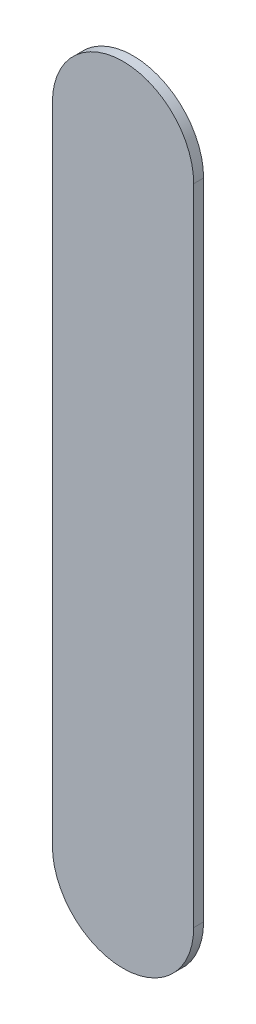
ISO-10303-21;
HEADER;
FILE_DESCRIPTION(('STEP AP214'),'2;1');
FILE_NAME('part.step','',(''),(''),'','','');
FILE_SCHEMA(('AUTOMOTIVE_DESIGN { 1 0 10303 214 1 1 1 1 }'));
ENDSEC;
DATA;
#1=APPLICATION_CONTEXT('core data for automotive mechanical design processes');
#2=APPLICATION_PROTOCOL_DEFINITION('international standard','automotive_design',2000,#1);
#3=PRODUCT_CONTEXT('',#1,'mechanical');
#4=PRODUCT('Part','Part','',(#3));
#5=PRODUCT_RELATED_PRODUCT_CATEGORY('part','',(#4));
#6=PRODUCT_DEFINITION_FORMATION('','',#4);
#7=PRODUCT_DEFINITION_CONTEXT('part definition',#1,'design');
#8=PRODUCT_DEFINITION('design','',#6,#7);
#9=PRODUCT_DEFINITION_SHAPE('','',#8);
#10=(LENGTH_UNIT() NAMED_UNIT(*) SI_UNIT(.MILLI.,.METRE.));
#11=(NAMED_UNIT(*) PLANE_ANGLE_UNIT() SI_UNIT($,.RADIAN.));
#12=(NAMED_UNIT(*) SI_UNIT($,.STERADIAN.) SOLID_ANGLE_UNIT());
#13=UNCERTAINTY_MEASURE_WITH_UNIT(LENGTH_MEASURE(1.E-05),#10,'distance_accuracy_value','');
#14=(GEOMETRIC_REPRESENTATION_CONTEXT(3) GLOBAL_UNCERTAINTY_ASSIGNED_CONTEXT((#13)) GLOBAL_UNIT_ASSIGNED_CONTEXT((#10,
#11,#12)) REPRESENTATION_CONTEXT('',''));
#15=CARTESIAN_POINT('',(0.,0.,0.));
#16=DIRECTION('',(0.,0.,1.));
#17=DIRECTION('',(1.,0.,0.));
#18=AXIS2_PLACEMENT_3D('',#15,#16,#17);
#19=CARTESIAN_POINT('',(104.515499,-61.11,1.635));
#20=DIRECTION('',(0.,0.,1.));
#21=DIRECTION('',(1.,0.,0.));
#22=AXIS2_PLACEMENT_3D('',#19,#20,#21);
#23=PLANE('',#22);
#24=DIRECTION('',(0.,1.,0.));
#25=VECTOR('',#24,1.);
#26=CARTESIAN_POINT('',(104.515499,-61.11,1.635));
#27=LINE('',#26,#25);
#28=CARTESIAN_POINT('',(104.515499,-61.11,1.635));
#29=VERTEX_POINT('',#28);
#30=CARTESIAN_POINT('',(104.515499,-58.83,1.635));
#31=VERTEX_POINT('',#30);
#32=EDGE_CURVE('E82',#29,#31,#27,.T.);
#33=ORIENTED_EDGE('',*,*,#32,.T.);
#34=CARTESIAN_POINT('',(104.265499,-58.83,1.635));
#35=DIRECTION('',(0.,0.,1.));
#36=DIRECTION('',(1.,0.,0.));
#37=AXIS2_PLACEMENT_3D('',#34,#35,#36);
#38=CIRCLE('',#37,0.25);
#39=CARTESIAN_POINT('',(104.015499,-58.83,1.635));
#40=VERTEX_POINT('',#39);
#41=EDGE_CURVE('E107',#31,#40,#38,.T.);
#42=ORIENTED_EDGE('',*,*,#41,.T.);
#43=DIRECTION('',(0.,-1.,0.));
#44=VECTOR('',#43,1.);
#45=CARTESIAN_POINT('',(104.015499,-58.83,1.635));
#46=LINE('',#45,#44);
#47=CARTESIAN_POINT('',(104.015499,-61.11,1.635));
#48=VERTEX_POINT('',#47);
#49=EDGE_CURVE('E74',#40,#48,#46,.T.);
#50=ORIENTED_EDGE('',*,*,#49,.T.);
#51=CARTESIAN_POINT('',(104.265499,-61.11,1.635));
#52=DIRECTION('',(0.,0.,1.));
#53=DIRECTION('',(-1.,0.,0.));
#54=AXIS2_PLACEMENT_3D('',#51,#52,#53);
#55=CIRCLE('',#54,0.25);
#56=EDGE_CURVE('E11',#48,#29,#55,.T.);
#57=ORIENTED_EDGE('',*,*,#56,.T.);
#58=EDGE_LOOP('',(#33,#42,#50,#57));
#59=FACE_BOUND('',#58,.T.);
#60=ADVANCED_FACE('F17',(#59),#23,.T.);
#61=CARTESIAN_POINT('',(104.515499,-61.11,1.6));
#62=DIRECTION('',(0.,0.,1.));
#63=DIRECTION('',(1.,0.,0.));
#64=AXIS2_PLACEMENT_3D('',#61,#62,#63);
#65=PLANE('',#64);
#66=CARTESIAN_POINT('',(104.265499,-61.11,1.6));
#67=DIRECTION('',(0.,0.,1.));
#68=DIRECTION('',(-1.,0.,0.));
#69=AXIS2_PLACEMENT_3D('',#66,#67,#68);
#70=CIRCLE('',#69,0.25);
#71=CARTESIAN_POINT('',(104.015499,-61.11,1.6));
#72=VERTEX_POINT('',#71);
#73=CARTESIAN_POINT('',(104.515499,-61.11,1.6));
#74=VERTEX_POINT('',#73);
#75=EDGE_CURVE('E25',#72,#74,#70,.T.);
#76=ORIENTED_EDGE('',*,*,#75,.F.);
#77=DIRECTION('',(0.,-1.,0.));
#78=VECTOR('',#77,1.);
#79=CARTESIAN_POINT('',(104.015499,-58.83,1.6));
#80=LINE('',#79,#78);
#81=CARTESIAN_POINT('',(104.015499,-58.83,1.6));
#82=VERTEX_POINT('',#81);
#83=EDGE_CURVE('E111',#82,#72,#80,.T.);
#84=ORIENTED_EDGE('',*,*,#83,.F.);
#85=CARTESIAN_POINT('',(104.265499,-58.83,1.6));
#86=DIRECTION('',(0.,0.,1.));
#87=DIRECTION('',(1.,0.,0.));
#88=AXIS2_PLACEMENT_3D('',#85,#86,#87);
#89=CIRCLE('',#88,0.25);
#90=CARTESIAN_POINT('',(104.515499,-58.83,1.6));
#91=VERTEX_POINT('',#90);
#92=EDGE_CURVE('E84',#91,#82,#89,.T.);
#93=ORIENTED_EDGE('',*,*,#92,.F.);
#94=DIRECTION('',(0.,1.,0.));
#95=VECTOR('',#94,1.);
#96=CARTESIAN_POINT('',(104.515499,-61.11,1.6));
#97=LINE('',#96,#95);
#98=EDGE_CURVE('E80',#74,#91,#97,.T.);
#99=ORIENTED_EDGE('',*,*,#98,.F.);
#100=EDGE_LOOP('',(#76,#84,#93,#99));
#101=FACE_BOUND('',#100,.T.);
#102=ADVANCED_FACE('F86',(#101),#65,.F.);
#103=CARTESIAN_POINT('',(104.265499,-61.11,1.6));
#104=DIRECTION('',(0.,0.,-1.));
#105=DIRECTION('',(-1.,0.,0.));
#106=AXIS2_PLACEMENT_3D('',#103,#104,#105);
#107=CYLINDRICAL_SURFACE('',#106,0.25);
#108=ORIENTED_EDGE('',*,*,#75,.T.);
#109=DIRECTION('',(0.,0.,1.));
#110=VECTOR('',#109,1.);
#111=CARTESIAN_POINT('',(104.515499,-61.11,1.6));
#112=LINE('',#111,#110);
#113=EDGE_CURVE('E68',#74,#29,#112,.T.);
#114=ORIENTED_EDGE('',*,*,#113,.T.);
#115=ORIENTED_EDGE('',*,*,#56,.F.);
#116=DIRECTION('',(0.,0.,1.));
#117=VECTOR('',#116,1.);
#118=CARTESIAN_POINT('',(104.015499,-61.11,1.6));
#119=LINE('',#118,#117);
#120=EDGE_CURVE('E71',#72,#48,#119,.T.);
#121=ORIENTED_EDGE('',*,*,#120,.F.);
#122=EDGE_LOOP('',(#108,#114,#115,#121));
#123=FACE_BOUND('',#122,.T.);
#124=ADVANCED_FACE('F67',(#123),#107,.T.);
#125=CARTESIAN_POINT('',(104.015499,-58.83,1.6));
#126=DIRECTION('',(1.,0.,0.));
#127=DIRECTION('',(0.,1.,0.));
#128=AXIS2_PLACEMENT_3D('',#125,#126,#127);
#129=PLANE('',#128);
#130=ORIENTED_EDGE('',*,*,#83,.T.);
#131=ORIENTED_EDGE('',*,*,#120,.T.);
#132=ORIENTED_EDGE('',*,*,#49,.F.);
#133=DIRECTION('',(0.,0.,1.));
#134=VECTOR('',#133,1.);
#135=CARTESIAN_POINT('',(104.015499,-58.83,1.6));
#136=LINE('',#135,#134);
#137=EDGE_CURVE('E103',#82,#40,#136,.T.);
#138=ORIENTED_EDGE('',*,*,#137,.F.);
#139=EDGE_LOOP('',(#130,#131,#132,#138));
#140=FACE_BOUND('',#139,.T.);
#141=ADVANCED_FACE('F122',(#140),#129,.F.);
#142=CARTESIAN_POINT('',(104.265499,-58.83,1.6));
#143=DIRECTION('',(0.,0.,-1.));
#144=DIRECTION('',(1.,0.,0.));
#145=AXIS2_PLACEMENT_3D('',#142,#143,#144);
#146=CYLINDRICAL_SURFACE('',#145,0.25);
#147=ORIENTED_EDGE('',*,*,#92,.T.);
#148=ORIENTED_EDGE('',*,*,#137,.T.);
#149=ORIENTED_EDGE('',*,*,#41,.F.);
#150=DIRECTION('',(0.,0.,1.));
#151=VECTOR('',#150,1.);
#152=CARTESIAN_POINT('',(104.515499,-58.83,1.6));
#153=LINE('',#152,#151);
#154=EDGE_CURVE('E90',#91,#31,#153,.T.);
#155=ORIENTED_EDGE('',*,*,#154,.F.);
#156=EDGE_LOOP('',(#147,#148,#149,#155));
#157=FACE_BOUND('',#156,.T.);
#158=ADVANCED_FACE('F124',(#157),#146,.T.);
#159=CARTESIAN_POINT('',(104.515499,-61.11,1.6));
#160=DIRECTION('',(-1.,0.,0.));
#161=DIRECTION('',(0.,0.,1.));
#162=AXIS2_PLACEMENT_3D('',#159,#160,#161);
#163=PLANE('',#162);
#164=ORIENTED_EDGE('',*,*,#98,.T.);
#165=ORIENTED_EDGE('',*,*,#154,.T.);
#166=ORIENTED_EDGE('',*,*,#32,.F.);
#167=ORIENTED_EDGE('',*,*,#113,.F.);
#168=EDGE_LOOP('',(#164,#165,#166,#167));
#169=FACE_BOUND('',#168,.T.);
#170=ADVANCED_FACE('F78',(#169),#163,.F.);
#171=CLOSED_SHELL('',(#60,#102,#124,#141,#158,#170));
#172=MANIFOLD_SOLID_BREP('B1',#171);
#173=ADVANCED_BREP_SHAPE_REPRESENTATION('',(#18,#172),#14);
#174=SHAPE_DEFINITION_REPRESENTATION(#9,#173);
ENDSEC;
END-ISO-10303-21;
